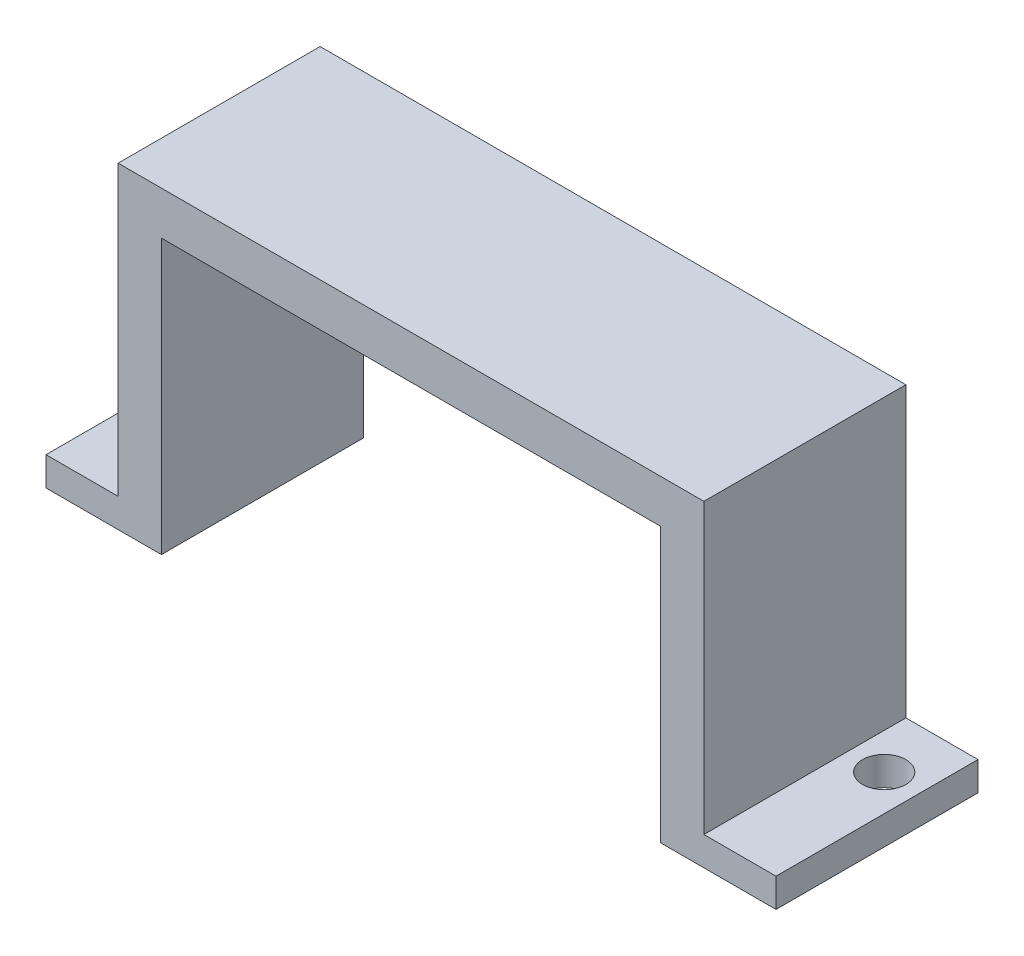
ISO-10303-21;
HEADER;
FILE_DESCRIPTION(('STEP AP214'),'2;1');
FILE_NAME('part.step','',(''),(''),'','','');
FILE_SCHEMA(('AUTOMOTIVE_DESIGN { 1 0 10303 214 1 1 1 1 }'));
ENDSEC;
DATA;
#1=APPLICATION_CONTEXT('core data for automotive mechanical design processes');
#2=APPLICATION_PROTOCOL_DEFINITION('international standard','automotive_design',2000,#1);
#3=PRODUCT_CONTEXT('',#1,'mechanical');
#4=PRODUCT('Part','Part','',(#3));
#5=PRODUCT_RELATED_PRODUCT_CATEGORY('part','',(#4));
#6=PRODUCT_DEFINITION_FORMATION('','',#4);
#7=PRODUCT_DEFINITION_CONTEXT('part definition',#1,'design');
#8=PRODUCT_DEFINITION('design','',#6,#7);
#9=PRODUCT_DEFINITION_SHAPE('','',#8);
#10=(LENGTH_UNIT() NAMED_UNIT(*) SI_UNIT(.MILLI.,.METRE.));
#11=(NAMED_UNIT(*) PLANE_ANGLE_UNIT() SI_UNIT($,.RADIAN.));
#12=(NAMED_UNIT(*) SI_UNIT($,.STERADIAN.) SOLID_ANGLE_UNIT());
#13=UNCERTAINTY_MEASURE_WITH_UNIT(LENGTH_MEASURE(1.E-05),#10,'distance_accuracy_value','');
#14=(GEOMETRIC_REPRESENTATION_CONTEXT(3) GLOBAL_UNCERTAINTY_ASSIGNED_CONTEXT((#13)) GLOBAL_UNIT_ASSIGNED_CONTEXT((#10,
#11,#12)) REPRESENTATION_CONTEXT('',''));
#15=CARTESIAN_POINT('',(0.,0.,0.));
#16=DIRECTION('',(0.,0.,1.));
#17=DIRECTION('',(1.,0.,0.));
#18=AXIS2_PLACEMENT_3D('',#15,#16,#17);
#19=CARTESIAN_POINT('',(0.,-3.38000000000001,14.));
#20=DIRECTION('',(0.,1.,0.));
#21=DIRECTION('',(-1.,0.,0.));
#22=AXIS2_PLACEMENT_3D('',#19,#20,#21);
#23=PLANE('',#22);
#24=CARTESIAN_POINT('',(14.43,-3.38,4.));
#25=DIRECTION('',(0.,1.,0.));
#26=DIRECTION('',(0.,0.,1.));
#27=AXIS2_PLACEMENT_3D('',#24,#25,#26);
#28=CIRCLE('',#27,1.5);
#29=CARTESIAN_POINT('',(14.43,-3.38,5.5));
#30=VERTEX_POINT('',#29);
#31=EDGE_CURVE('E266',#30,#30,#28,.T.);
#32=ORIENTED_EDGE('',*,*,#31,.T.);
#33=EDGE_LOOP('',(#32));
#34=FACE_BOUND('',#33,.T.);
#35=DIRECTION('',(1.,0.,0.));
#36=VECTOR('',#35,1.);
#37=CARTESIAN_POINT('',(0.,-3.38000000000001,0.));
#38=LINE('',#37,#36);
#39=CARTESIAN_POINT('',(8.93,-3.38,0.));
#40=VERTEX_POINT('',#39);
#41=CARTESIAN_POINT('',(16.93,-3.38,0.));
#42=VERTEX_POINT('',#41);
#43=EDGE_CURVE('E162',#40,#42,#38,.T.);
#44=ORIENTED_EDGE('',*,*,#43,.T.);
#45=DIRECTION('',(0.,0.,-1.));
#46=VECTOR('',#45,1.);
#47=CARTESIAN_POINT('',(16.93,-3.38,14.));
#48=LINE('',#47,#46);
#49=CARTESIAN_POINT('',(16.93,-3.38,14.));
#50=VERTEX_POINT('',#49);
#51=EDGE_CURVE('E11',#50,#42,#48,.T.);
#52=ORIENTED_EDGE('',*,*,#51,.F.);
#53=DIRECTION('',(1.,0.,0.));
#54=VECTOR('',#53,1.);
#55=CARTESIAN_POINT('',(0.,-3.38000000000001,14.));
#56=LINE('',#55,#54);
#57=CARTESIAN_POINT('',(8.93,-3.38,14.));
#58=VERTEX_POINT('',#57);
#59=EDGE_CURVE('E195',#58,#50,#56,.T.);
#60=ORIENTED_EDGE('',*,*,#59,.F.);
#61=DIRECTION('',(0.,0.,-1.));
#62=VECTOR('',#61,1.);
#63=CARTESIAN_POINT('',(8.93,-3.38,14.));
#64=LINE('',#63,#62);
#65=EDGE_CURVE('E57',#58,#40,#64,.T.);
#66=ORIENTED_EDGE('',*,*,#65,.T.);
#67=EDGE_LOOP('',(#44,#52,#60,#66));
#68=FACE_BOUND('',#67,.T.);
#69=ADVANCED_FACE('F41',(#34,#68),#23,.F.);
#70=CARTESIAN_POINT('',(16.93,0.,14.));
#71=DIRECTION('',(-1.,0.,0.));
#72=DIRECTION('',(0.,0.,1.));
#73=AXIS2_PLACEMENT_3D('',#70,#71,#72);
#74=PLANE('',#73);
#75=DIRECTION('',(0.,1.,0.));
#76=VECTOR('',#75,1.);
#77=CARTESIAN_POINT('',(16.93,0.,0.));
#78=LINE('',#77,#76);
#79=CARTESIAN_POINT('',(16.93,-1.38,0.));
#80=VERTEX_POINT('',#79);
#81=EDGE_CURVE('E164',#42,#80,#78,.T.);
#82=ORIENTED_EDGE('',*,*,#81,.T.);
#83=DIRECTION('',(0.,0.,-1.));
#84=VECTOR('',#83,1.);
#85=CARTESIAN_POINT('',(16.93,-1.38,14.));
#86=LINE('',#85,#84);
#87=CARTESIAN_POINT('',(16.93,-1.38,14.));
#88=VERTEX_POINT('',#87);
#89=EDGE_CURVE('E49',#88,#80,#86,.T.);
#90=ORIENTED_EDGE('',*,*,#89,.F.);
#91=DIRECTION('',(0.,1.,0.));
#92=VECTOR('',#91,1.);
#93=CARTESIAN_POINT('',(16.93,0.,14.));
#94=LINE('',#93,#92);
#95=EDGE_CURVE('E108',#50,#88,#94,.T.);
#96=ORIENTED_EDGE('',*,*,#95,.F.);
#97=ORIENTED_EDGE('',*,*,#51,.T.);
#98=EDGE_LOOP('',(#82,#90,#96,#97));
#99=FACE_BOUND('',#98,.T.);
#100=ADVANCED_FACE('F216',(#99),#74,.F.);
#101=CARTESIAN_POINT('',(0.,-1.38,14.));
#102=DIRECTION('',(0.,1.,0.));
#103=DIRECTION('',(-1.,0.,0.));
#104=AXIS2_PLACEMENT_3D('',#101,#102,#103);
#105=PLANE('',#104);
#106=CARTESIAN_POINT('',(14.43,-1.38,4.));
#107=DIRECTION('',(0.,1.,0.));
#108=DIRECTION('',(0.,0.,1.));
#109=AXIS2_PLACEMENT_3D('',#106,#107,#108);
#110=CIRCLE('',#109,1.49999999999999);
#111=CARTESIAN_POINT('',(14.43,-1.38,5.49999999999999));
#112=VERTEX_POINT('',#111);
#113=EDGE_CURVE('E274',#112,#112,#110,.T.);
#114=ORIENTED_EDGE('',*,*,#113,.F.);
#115=EDGE_LOOP('',(#114));
#116=FACE_BOUND('',#115,.T.);
#117=DIRECTION('',(1.,0.,0.));
#118=VECTOR('',#117,1.);
#119=CARTESIAN_POINT('',(0.,-1.38,0.));
#120=LINE('',#119,#118);
#121=CARTESIAN_POINT('',(11.93,-1.38,0.));
#122=VERTEX_POINT('',#121);
#123=EDGE_CURVE('E168',#122,#80,#120,.T.);
#124=ORIENTED_EDGE('',*,*,#123,.F.);
#125=DIRECTION('',(0.,0.,-1.));
#126=VECTOR('',#125,1.);
#127=CARTESIAN_POINT('',(11.93,-1.38,14.));
#128=LINE('',#127,#126);
#129=CARTESIAN_POINT('',(11.93,-1.38,14.));
#130=VERTEX_POINT('',#129);
#131=EDGE_CURVE('E209',#130,#122,#128,.T.);
#132=ORIENTED_EDGE('',*,*,#131,.F.);
#133=DIRECTION('',(1.,0.,0.));
#134=VECTOR('',#133,1.);
#135=CARTESIAN_POINT('',(0.,-1.38,14.));
#136=LINE('',#135,#134);
#137=EDGE_CURVE('E215',#130,#88,#136,.T.);
#138=ORIENTED_EDGE('',*,*,#137,.T.);
#139=ORIENTED_EDGE('',*,*,#89,.T.);
#140=EDGE_LOOP('',(#124,#132,#138,#139));
#141=FACE_BOUND('',#140,.T.);
#142=ADVANCED_FACE('F213',(#116,#141),#105,.T.);
#143=CARTESIAN_POINT('',(11.93,0.,14.));
#144=DIRECTION('',(-1.,0.,0.));
#145=DIRECTION('',(0.,0.,1.));
#146=AXIS2_PLACEMENT_3D('',#143,#144,#145);
#147=PLANE('',#146);
#148=DIRECTION('',(0.,1.,0.));
#149=VECTOR('',#148,1.);
#150=CARTESIAN_POINT('',(11.93,0.,0.));
#151=LINE('',#150,#149);
#152=CARTESIAN_POINT('',(11.93,18.62,0.));
#153=VERTEX_POINT('',#152);
#154=EDGE_CURVE('E171',#122,#153,#151,.T.);
#155=ORIENTED_EDGE('',*,*,#154,.T.);
#156=DIRECTION('',(0.,0.,-1.));
#157=VECTOR('',#156,1.);
#158=CARTESIAN_POINT('',(11.93,18.62,14.));
#159=LINE('',#158,#157);
#160=CARTESIAN_POINT('',(11.93,18.62,14.));
#161=VERTEX_POINT('',#160);
#162=EDGE_CURVE('E207',#161,#153,#159,.T.);
#163=ORIENTED_EDGE('',*,*,#162,.F.);
#164=DIRECTION('',(0.,1.,0.));
#165=VECTOR('',#164,1.);
#166=CARTESIAN_POINT('',(11.93,0.,14.));
#167=LINE('',#166,#165);
#168=EDGE_CURVE('E227',#130,#161,#167,.T.);
#169=ORIENTED_EDGE('',*,*,#168,.F.);
#170=ORIENTED_EDGE('',*,*,#131,.T.);
#171=EDGE_LOOP('',(#155,#163,#169,#170));
#172=FACE_BOUND('',#171,.T.);
#173=ADVANCED_FACE('F224',(#172),#147,.F.);
#174=CARTESIAN_POINT('',(0.,18.62,14.));
#175=DIRECTION('',(0.,1.,0.));
#176=DIRECTION('',(0.,0.,1.));
#177=AXIS2_PLACEMENT_3D('',#174,#175,#176);
#178=PLANE('',#177);
#179=DIRECTION('',(1.,0.,0.));
#180=VECTOR('',#179,1.);
#181=CARTESIAN_POINT('',(0.,18.62,0.));
#182=LINE('',#181,#180);
#183=CARTESIAN_POINT('',(-28.67,18.62,0.));
#184=VERTEX_POINT('',#183);
#185=EDGE_CURVE('E174',#184,#153,#182,.T.);
#186=ORIENTED_EDGE('',*,*,#185,.F.);
#187=DIRECTION('',(0.,0.,-1.));
#188=VECTOR('',#187,1.);
#189=CARTESIAN_POINT('',(-28.67,18.62,14.));
#190=LINE('',#189,#188);
#191=CARTESIAN_POINT('',(-28.67,18.62,14.));
#192=VERTEX_POINT('',#191);
#193=EDGE_CURVE('E205',#192,#184,#190,.T.);
#194=ORIENTED_EDGE('',*,*,#193,.F.);
#195=DIRECTION('',(1.,0.,0.));
#196=VECTOR('',#195,1.);
#197=CARTESIAN_POINT('',(0.,18.62,14.));
#198=LINE('',#197,#196);
#199=EDGE_CURVE('E229',#192,#161,#198,.T.);
#200=ORIENTED_EDGE('',*,*,#199,.T.);
#201=ORIENTED_EDGE('',*,*,#162,.T.);
#202=EDGE_LOOP('',(#186,#194,#200,#201));
#203=FACE_BOUND('',#202,.T.);
#204=ADVANCED_FACE('F285',(#203),#178,.T.);
#205=CARTESIAN_POINT('',(-28.67,0.,14.));
#206=DIRECTION('',(-1.,0.,0.));
#207=DIRECTION('',(0.,-1.,0.));
#208=AXIS2_PLACEMENT_3D('',#205,#206,#207);
#209=PLANE('',#208);
#210=DIRECTION('',(0.,1.,0.));
#211=VECTOR('',#210,1.);
#212=CARTESIAN_POINT('',(-28.67,0.,0.));
#213=LINE('',#212,#211);
#214=CARTESIAN_POINT('',(-28.67,-1.38,0.));
#215=VERTEX_POINT('',#214);
#216=EDGE_CURVE('E177',#215,#184,#213,.T.);
#217=ORIENTED_EDGE('',*,*,#216,.F.);
#218=DIRECTION('',(0.,0.,-1.));
#219=VECTOR('',#218,1.);
#220=CARTESIAN_POINT('',(-28.67,-1.38,14.));
#221=LINE('',#220,#219);
#222=CARTESIAN_POINT('',(-28.67,-1.38,14.));
#223=VERTEX_POINT('',#222);
#224=EDGE_CURVE('E203',#223,#215,#221,.T.);
#225=ORIENTED_EDGE('',*,*,#224,.F.);
#226=DIRECTION('',(0.,1.,0.));
#227=VECTOR('',#226,1.);
#228=CARTESIAN_POINT('',(-28.67,0.,14.));
#229=LINE('',#228,#227);
#230=EDGE_CURVE('E236',#223,#192,#229,.T.);
#231=ORIENTED_EDGE('',*,*,#230,.T.);
#232=ORIENTED_EDGE('',*,*,#193,.T.);
#233=EDGE_LOOP('',(#217,#225,#231,#232));
#234=FACE_BOUND('',#233,.T.);
#235=ADVANCED_FACE('F290',(#234),#209,.T.);
#236=CARTESIAN_POINT('',(0.,-1.38,14.));
#237=DIRECTION('',(0.,-1.,0.));
#238=DIRECTION('',(1.,0.,0.));
#239=AXIS2_PLACEMENT_3D('',#236,#237,#238);
#240=PLANE('',#239);
#241=CARTESIAN_POINT('',(-31.17,-1.38,4.));
#242=DIRECTION('',(0.,1.,0.));
#243=DIRECTION('',(0.,0.,1.));
#244=AXIS2_PLACEMENT_3D('',#241,#242,#243);
#245=CIRCLE('',#244,1.49999999999999);
#246=CARTESIAN_POINT('',(-31.17,-1.38,5.49999999999999));
#247=VERTEX_POINT('',#246);
#248=EDGE_CURVE('E270',#247,#247,#245,.T.);
#249=ORIENTED_EDGE('',*,*,#248,.F.);
#250=EDGE_LOOP('',(#249));
#251=FACE_BOUND('',#250,.T.);
#252=DIRECTION('',(-1.,0.,0.));
#253=VECTOR('',#252,1.);
#254=CARTESIAN_POINT('',(0.,-1.38,0.));
#255=LINE('',#254,#253);
#256=CARTESIAN_POINT('',(-33.67,-1.38000000000001,0.));
#257=VERTEX_POINT('',#256);
#258=EDGE_CURVE('E180',#215,#257,#255,.T.);
#259=ORIENTED_EDGE('',*,*,#258,.T.);
#260=DIRECTION('',(0.,0.,-1.));
#261=VECTOR('',#260,1.);
#262=CARTESIAN_POINT('',(-33.67,-1.38000000000001,14.));
#263=LINE('',#262,#261);
#264=CARTESIAN_POINT('',(-33.67,-1.38000000000001,14.));
#265=VERTEX_POINT('',#264);
#266=EDGE_CURVE('E201',#265,#257,#263,.T.);
#267=ORIENTED_EDGE('',*,*,#266,.F.);
#268=DIRECTION('',(-1.,0.,0.));
#269=VECTOR('',#268,1.);
#270=CARTESIAN_POINT('',(0.,-1.38,14.));
#271=LINE('',#270,#269);
#272=EDGE_CURVE('E239',#223,#265,#271,.T.);
#273=ORIENTED_EDGE('',*,*,#272,.F.);
#274=ORIENTED_EDGE('',*,*,#224,.T.);
#275=EDGE_LOOP('',(#259,#267,#273,#274));
#276=FACE_BOUND('',#275,.T.);
#277=ADVANCED_FACE('F294',(#251,#276),#240,.F.);
#278=CARTESIAN_POINT('',(-33.67,0.,14.));
#279=DIRECTION('',(-1.,0.,0.));
#280=DIRECTION('',(0.,0.,1.));
#281=AXIS2_PLACEMENT_3D('',#278,#279,#280);
#282=PLANE('',#281);
#283=DIRECTION('',(0.,1.,0.));
#284=VECTOR('',#283,1.);
#285=CARTESIAN_POINT('',(-33.67,0.,0.));
#286=LINE('',#285,#284);
#287=CARTESIAN_POINT('',(-33.67,-3.38000000000001,0.));
#288=VERTEX_POINT('',#287);
#289=EDGE_CURVE('E183',#288,#257,#286,.T.);
#290=ORIENTED_EDGE('',*,*,#289,.F.);
#291=DIRECTION('',(0.,0.,-1.));
#292=VECTOR('',#291,1.);
#293=CARTESIAN_POINT('',(-33.67,-3.38000000000001,14.));
#294=LINE('',#293,#292);
#295=CARTESIAN_POINT('',(-33.67,-3.38000000000001,14.));
#296=VERTEX_POINT('',#295);
#297=EDGE_CURVE('E199',#296,#288,#294,.T.);
#298=ORIENTED_EDGE('',*,*,#297,.F.);
#299=DIRECTION('',(0.,1.,0.));
#300=VECTOR('',#299,1.);
#301=CARTESIAN_POINT('',(-33.67,0.,14.));
#302=LINE('',#301,#300);
#303=EDGE_CURVE('E241',#296,#265,#302,.T.);
#304=ORIENTED_EDGE('',*,*,#303,.T.);
#305=ORIENTED_EDGE('',*,*,#266,.T.);
#306=EDGE_LOOP('',(#290,#298,#304,#305));
#307=FACE_BOUND('',#306,.T.);
#308=ADVANCED_FACE('F297',(#307),#282,.T.);
#309=CARTESIAN_POINT('',(0.,-3.38,14.));
#310=DIRECTION('',(0.,-1.,0.));
#311=DIRECTION('',(1.,0.,0.));
#312=AXIS2_PLACEMENT_3D('',#309,#310,#311);
#313=PLANE('',#312);
#314=CARTESIAN_POINT('',(-31.17,-3.38,4.));
#315=DIRECTION('',(0.,1.,0.));
#316=DIRECTION('',(0.,0.,1.));
#317=AXIS2_PLACEMENT_3D('',#314,#315,#316);
#318=CIRCLE('',#317,1.5);
#319=CARTESIAN_POINT('',(-31.17,-3.38,5.5));
#320=VERTEX_POINT('',#319);
#321=EDGE_CURVE('E165',#320,#320,#318,.T.);
#322=ORIENTED_EDGE('',*,*,#321,.T.);
#323=EDGE_LOOP('',(#322));
#324=FACE_BOUND('',#323,.T.);
#325=DIRECTION('',(-1.,0.,0.));
#326=VECTOR('',#325,1.);
#327=CARTESIAN_POINT('',(0.,-3.38,0.));
#328=LINE('',#327,#326);
#329=CARTESIAN_POINT('',(-25.67,-3.38,0.));
#330=VERTEX_POINT('',#329);
#331=EDGE_CURVE('E186',#330,#288,#328,.T.);
#332=ORIENTED_EDGE('',*,*,#331,.F.);
#333=DIRECTION('',(0.,0.,-1.));
#334=VECTOR('',#333,1.);
#335=CARTESIAN_POINT('',(-25.67,-3.38,14.));
#336=LINE('',#335,#334);
#337=CARTESIAN_POINT('',(-25.67,-3.38,14.));
#338=VERTEX_POINT('',#337);
#339=EDGE_CURVE('E154',#338,#330,#336,.T.);
#340=ORIENTED_EDGE('',*,*,#339,.F.);
#341=DIRECTION('',(-1.,0.,0.));
#342=VECTOR('',#341,1.);
#343=CARTESIAN_POINT('',(0.,-3.38,14.));
#344=LINE('',#343,#342);
#345=EDGE_CURVE('E144',#338,#296,#344,.T.);
#346=ORIENTED_EDGE('',*,*,#345,.T.);
#347=ORIENTED_EDGE('',*,*,#297,.T.);
#348=EDGE_LOOP('',(#332,#340,#346,#347));
#349=FACE_BOUND('',#348,.T.);
#350=ADVANCED_FACE('F245',(#324,#349),#313,.T.);
#351=CARTESIAN_POINT('',(-25.67,0.,14.));
#352=DIRECTION('',(-1.,0.,0.));
#353=DIRECTION('',(0.,0.,1.));
#354=AXIS2_PLACEMENT_3D('',#351,#352,#353);
#355=PLANE('',#354);
#356=DIRECTION('',(0.,1.,0.));
#357=VECTOR('',#356,1.);
#358=CARTESIAN_POINT('',(-25.67,0.,0.));
#359=LINE('',#358,#357);
#360=CARTESIAN_POINT('',(-25.67,15.62,0.));
#361=VERTEX_POINT('',#360);
#362=EDGE_CURVE('E151',#330,#361,#359,.T.);
#363=ORIENTED_EDGE('',*,*,#362,.T.);
#364=DIRECTION('',(0.,0.,-1.));
#365=VECTOR('',#364,1.);
#366=CARTESIAN_POINT('',(-25.67,15.62,14.));
#367=LINE('',#366,#365);
#368=CARTESIAN_POINT('',(-25.67,15.62,14.));
#369=VERTEX_POINT('',#368);
#370=EDGE_CURVE('E148',#369,#361,#367,.T.);
#371=ORIENTED_EDGE('',*,*,#370,.F.);
#372=DIRECTION('',(0.,1.,0.));
#373=VECTOR('',#372,1.);
#374=CARTESIAN_POINT('',(-25.67,0.,14.));
#375=LINE('',#374,#373);
#376=EDGE_CURVE('E136',#338,#369,#375,.T.);
#377=ORIENTED_EDGE('',*,*,#376,.F.);
#378=ORIENTED_EDGE('',*,*,#339,.T.);
#379=EDGE_LOOP('',(#363,#371,#377,#378));
#380=FACE_BOUND('',#379,.T.);
#381=ADVANCED_FACE('F149',(#380),#355,.F.);
#382=CARTESIAN_POINT('',(0.,15.62,14.));
#383=DIRECTION('',(0.,1.,0.));
#384=DIRECTION('',(0.,0.,1.));
#385=AXIS2_PLACEMENT_3D('',#382,#383,#384);
#386=PLANE('',#385);
#387=DIRECTION('',(1.,0.,0.));
#388=VECTOR('',#387,1.);
#389=CARTESIAN_POINT('',(0.,15.62,0.));
#390=LINE('',#389,#388);
#391=CARTESIAN_POINT('',(8.93,15.62,0.));
#392=VERTEX_POINT('',#391);
#393=EDGE_CURVE('E190',#361,#392,#390,.T.);
#394=ORIENTED_EDGE('',*,*,#393,.T.);
#395=DIRECTION('',(0.,0.,-1.));
#396=VECTOR('',#395,1.);
#397=CARTESIAN_POINT('',(8.93,15.62,14.));
#398=LINE('',#397,#396);
#399=CARTESIAN_POINT('',(8.93,15.62,14.));
#400=VERTEX_POINT('',#399);
#401=EDGE_CURVE('E96',#400,#392,#398,.T.);
#402=ORIENTED_EDGE('',*,*,#401,.F.);
#403=DIRECTION('',(1.,0.,0.));
#404=VECTOR('',#403,1.);
#405=CARTESIAN_POINT('',(0.,15.62,14.));
#406=LINE('',#405,#404);
#407=EDGE_CURVE('E141',#369,#400,#406,.T.);
#408=ORIENTED_EDGE('',*,*,#407,.F.);
#409=ORIENTED_EDGE('',*,*,#370,.T.);
#410=EDGE_LOOP('',(#394,#402,#408,#409));
#411=FACE_BOUND('',#410,.T.);
#412=ADVANCED_FACE('F156',(#411),#386,.F.);
#413=CARTESIAN_POINT('',(8.93,0.,14.));
#414=DIRECTION('',(-1.,0.,0.));
#415=DIRECTION('',(0.,0.,1.));
#416=AXIS2_PLACEMENT_3D('',#413,#414,#415);
#417=PLANE('',#416);
#418=DIRECTION('',(0.,1.,0.));
#419=VECTOR('',#418,1.);
#420=CARTESIAN_POINT('',(8.93,0.,0.));
#421=LINE('',#420,#419);
#422=EDGE_CURVE('E192',#40,#392,#421,.T.);
#423=ORIENTED_EDGE('',*,*,#422,.F.);
#424=ORIENTED_EDGE('',*,*,#65,.F.);
#425=DIRECTION('',(0.,1.,0.));
#426=VECTOR('',#425,1.);
#427=CARTESIAN_POINT('',(8.93,0.,14.));
#428=LINE('',#427,#426);
#429=EDGE_CURVE('E157',#58,#400,#428,.T.);
#430=ORIENTED_EDGE('',*,*,#429,.T.);
#431=ORIENTED_EDGE('',*,*,#401,.T.);
#432=EDGE_LOOP('',(#423,#424,#430,#431));
#433=FACE_BOUND('',#432,.T.);
#434=ADVANCED_FACE('F247',(#433),#417,.T.);
#435=CARTESIAN_POINT('',(0.,0.,14.));
#436=DIRECTION('',(0.,0.,1.));
#437=DIRECTION('',(1.,0.,0.));
#438=AXIS2_PLACEMENT_3D('',#435,#436,#437);
#439=PLANE('',#438);
#440=ORIENTED_EDGE('',*,*,#59,.T.);
#441=ORIENTED_EDGE('',*,*,#95,.T.);
#442=ORIENTED_EDGE('',*,*,#137,.F.);
#443=ORIENTED_EDGE('',*,*,#168,.T.);
#444=ORIENTED_EDGE('',*,*,#199,.F.);
#445=ORIENTED_EDGE('',*,*,#230,.F.);
#446=ORIENTED_EDGE('',*,*,#272,.T.);
#447=ORIENTED_EDGE('',*,*,#303,.F.);
#448=ORIENTED_EDGE('',*,*,#345,.F.);
#449=ORIENTED_EDGE('',*,*,#376,.T.);
#450=ORIENTED_EDGE('',*,*,#407,.T.);
#451=ORIENTED_EDGE('',*,*,#429,.F.);
#452=EDGE_LOOP('',(#440,#441,#442,#443,#444,#445,#446,#447,#448,#449,#450,#451));
#453=FACE_BOUND('',#452,.T.);
#454=ADVANCED_FACE('F138',(#453),#439,.T.);
#455=CARTESIAN_POINT('',(0.,0.,0.));
#456=DIRECTION('',(0.,0.,1.));
#457=DIRECTION('',(1.,0.,0.));
#458=AXIS2_PLACEMENT_3D('',#455,#456,#457);
#459=PLANE('',#458);
#460=ORIENTED_EDGE('',*,*,#43,.F.);
#461=ORIENTED_EDGE('',*,*,#422,.T.);
#462=ORIENTED_EDGE('',*,*,#393,.F.);
#463=ORIENTED_EDGE('',*,*,#362,.F.);
#464=ORIENTED_EDGE('',*,*,#331,.T.);
#465=ORIENTED_EDGE('',*,*,#289,.T.);
#466=ORIENTED_EDGE('',*,*,#258,.F.);
#467=ORIENTED_EDGE('',*,*,#216,.T.);
#468=ORIENTED_EDGE('',*,*,#185,.T.);
#469=ORIENTED_EDGE('',*,*,#154,.F.);
#470=ORIENTED_EDGE('',*,*,#123,.T.);
#471=ORIENTED_EDGE('',*,*,#81,.F.);
#472=EDGE_LOOP('',(#460,#461,#462,#463,#464,#465,#466,#467,#468,#469,#470,#471));
#473=FACE_BOUND('',#472,.T.);
#474=ADVANCED_FACE('F220',(#473),#459,.F.);
#475=CARTESIAN_POINT('',(-31.17,-1.38,4.));
#476=DIRECTION('',(0.,1.,0.));
#477=DIRECTION('',(0.,0.,1.));
#478=AXIS2_PLACEMENT_3D('',#475,#476,#477);
#479=CYLINDRICAL_SURFACE('',#478,1.49999999999999);
#480=ORIENTED_EDGE('',*,*,#321,.F.);
#481=EDGE_LOOP('',(#480));
#482=FACE_BOUND('',#481,.T.);
#483=ORIENTED_EDGE('',*,*,#248,.T.);
#484=EDGE_LOOP('',(#483));
#485=FACE_BOUND('',#484,.T.);
#486=ADVANCED_FACE('F335',(#482,#485),#479,.F.);
#487=CARTESIAN_POINT('',(14.43,-1.38,4.));
#488=DIRECTION('',(0.,1.,0.));
#489=DIRECTION('',(0.,0.,1.));
#490=AXIS2_PLACEMENT_3D('',#487,#488,#489);
#491=CYLINDRICAL_SURFACE('',#490,1.49999999999999);
#492=ORIENTED_EDGE('',*,*,#31,.F.);
#493=EDGE_LOOP('',(#492));
#494=FACE_BOUND('',#493,.T.);
#495=ORIENTED_EDGE('',*,*,#113,.T.);
#496=EDGE_LOOP('',(#495));
#497=FACE_BOUND('',#496,.T.);
#498=ADVANCED_FACE('F278',(#494,#497),#491,.F.);
#499=CLOSED_SHELL('',(#69,#100,#142,#173,#204,#235,#277,#308,#350,#381,#412,#434,#454,#474,#486,#498));
#500=MANIFOLD_SOLID_BREP('B2',#499);
#501=ADVANCED_BREP_SHAPE_REPRESENTATION('',(#18,#500),#14);
#502=SHAPE_DEFINITION_REPRESENTATION(#9,#501);
ENDSEC;
END-ISO-10303-21;
